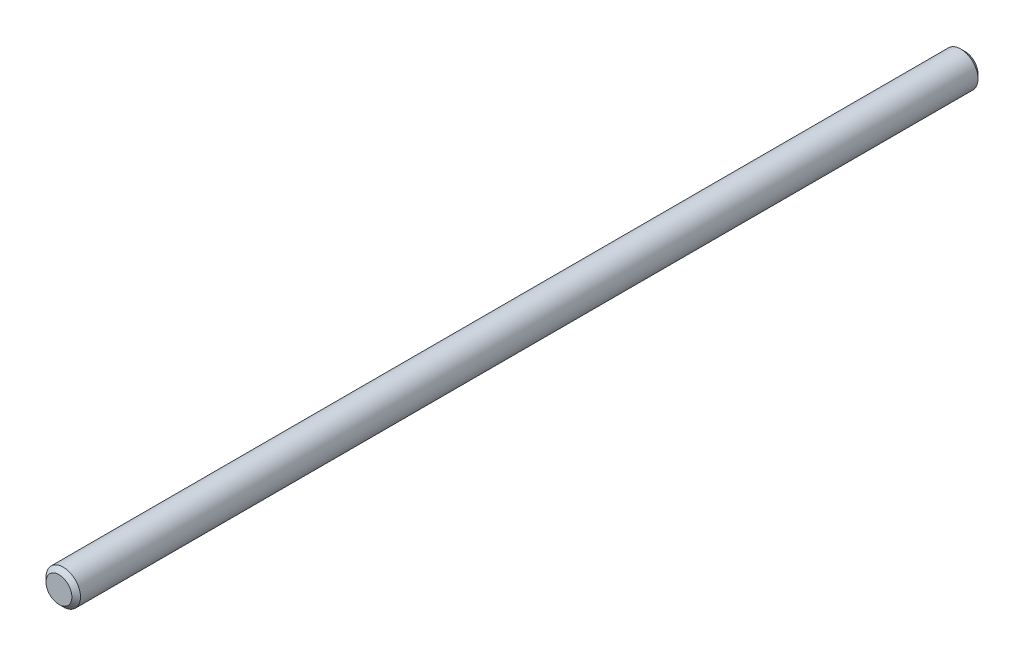
ISO-10303-21;
HEADER;
FILE_DESCRIPTION(('STEP AP214'),'2;1');
FILE_NAME('part.step','',(''),(''),'','','');
FILE_SCHEMA(('AUTOMOTIVE_DESIGN { 1 0 10303 214 1 1 1 1 }'));
ENDSEC;
DATA;
#1=APPLICATION_CONTEXT('core data for automotive mechanical design processes');
#2=APPLICATION_PROTOCOL_DEFINITION('international standard','automotive_design',2000,#1);
#3=PRODUCT_CONTEXT('',#1,'mechanical');
#4=PRODUCT('Part','Part','',(#3));
#5=PRODUCT_RELATED_PRODUCT_CATEGORY('part','',(#4));
#6=PRODUCT_DEFINITION_FORMATION('','',#4);
#7=PRODUCT_DEFINITION_CONTEXT('part definition',#1,'design');
#8=PRODUCT_DEFINITION('design','',#6,#7);
#9=PRODUCT_DEFINITION_SHAPE('','',#8);
#10=(LENGTH_UNIT() NAMED_UNIT(*) SI_UNIT(.MILLI.,.METRE.));
#11=(NAMED_UNIT(*) PLANE_ANGLE_UNIT() SI_UNIT($,.RADIAN.));
#12=(NAMED_UNIT(*) SI_UNIT($,.STERADIAN.) SOLID_ANGLE_UNIT());
#13=UNCERTAINTY_MEASURE_WITH_UNIT(LENGTH_MEASURE(1.E-05),#10,'distance_accuracy_value','');
#14=(GEOMETRIC_REPRESENTATION_CONTEXT(3) GLOBAL_UNCERTAINTY_ASSIGNED_CONTEXT((#13)) GLOBAL_UNIT_ASSIGNED_CONTEXT((#10,
#11,#12)) REPRESENTATION_CONTEXT('',''));
#15=CARTESIAN_POINT('',(0.,0.,0.));
#16=DIRECTION('',(0.,0.,1.));
#17=DIRECTION('',(1.,0.,0.));
#18=AXIS2_PLACEMENT_3D('',#15,#16,#17);
#19=CARTESIAN_POINT('',(0.,0.,210.));
#20=DIRECTION('',(0.,0.,-1.));
#21=DIRECTION('',(-1.,0.,0.));
#22=AXIS2_PLACEMENT_3D('',#19,#20,#21);
#23=CYLINDRICAL_SURFACE('',#22,4.);
#24=CARTESIAN_POINT('',(0.,0.,209.));
#25=DIRECTION('',(0.,0.,1.));
#26=DIRECTION('',(1.,0.,0.));
#27=AXIS2_PLACEMENT_3D('',#24,#25,#26);
#28=CIRCLE('',#27,4.);
#29=CARTESIAN_POINT('',(4.,0.,209.));
#30=VERTEX_POINT('',#29);
#31=EDGE_CURVE('E46',#30,#30,#28,.F.);
#32=ORIENTED_EDGE('',*,*,#31,.T.);
#33=EDGE_LOOP('',(#32));
#34=FACE_BOUND('',#33,.T.);
#35=CARTESIAN_POINT('',(0.,0.,0.999999999999945));
#36=DIRECTION('',(0.,0.,1.));
#37=DIRECTION('',(1.,0.,0.));
#38=AXIS2_PLACEMENT_3D('',#35,#36,#37);
#39=CIRCLE('',#38,4.);
#40=CARTESIAN_POINT('',(4.,0.,0.999999999999945));
#41=VERTEX_POINT('',#40);
#42=EDGE_CURVE('E50',#41,#41,#39,.T.);
#43=ORIENTED_EDGE('',*,*,#42,.T.);
#44=EDGE_LOOP('',(#43));
#45=FACE_BOUND('',#44,.T.);
#46=ADVANCED_FACE('F38',(#34,#45),#23,.T.);
#47=CARTESIAN_POINT('',(0.,0.,210.));
#48=DIRECTION('',(0.,0.,1.));
#49=DIRECTION('',(1.,0.,0.));
#50=AXIS2_PLACEMENT_3D('',#47,#48,#49);
#51=PLANE('',#50);
#52=CARTESIAN_POINT('',(0.,0.,210.));
#53=DIRECTION('',(0.,0.,1.));
#54=DIRECTION('',(1.,0.,0.));
#55=AXIS2_PLACEMENT_3D('',#52,#53,#54);
#56=CIRCLE('',#55,3.);
#57=CARTESIAN_POINT('',(3.,0.,210.));
#58=VERTEX_POINT('',#57);
#59=EDGE_CURVE('E54',#58,#58,#56,.T.);
#60=ORIENTED_EDGE('',*,*,#59,.T.);
#61=EDGE_LOOP('',(#60));
#62=FACE_BOUND('',#61,.T.);
#63=ADVANCED_FACE('F60',(#62),#51,.T.);
#64=CARTESIAN_POINT('',(0.,0.,0.));
#65=DIRECTION('',(0.,0.,1.));
#66=DIRECTION('',(1.,0.,0.));
#67=AXIS2_PLACEMENT_3D('',#64,#65,#66);
#68=PLANE('',#67);
#69=CARTESIAN_POINT('',(0.,0.,0.));
#70=DIRECTION('',(0.,0.,1.));
#71=DIRECTION('',(1.,0.,0.));
#72=AXIS2_PLACEMENT_3D('',#69,#70,#71);
#73=CIRCLE('',#72,3.00000000000003);
#74=CARTESIAN_POINT('',(3.00000000000003,0.,0.));
#75=VERTEX_POINT('',#74);
#76=EDGE_CURVE('E10',#75,#75,#73,.F.);
#77=ORIENTED_EDGE('',*,*,#76,.T.);
#78=EDGE_LOOP('',(#77));
#79=FACE_BOUND('',#78,.T.);
#80=ADVANCED_FACE('F64',(#79),#68,.F.);
#81=CARTESIAN_POINT('',(0.,0.,210.));
#82=DIRECTION('',(0.,0.,-1.));
#83=DIRECTION('',(-1.,0.,0.));
#84=AXIS2_PLACEMENT_3D('',#81,#82,#83);
#85=CONICAL_SURFACE('',#84,3.,0.78539816339746);
#86=ORIENTED_EDGE('',*,*,#31,.F.);
#87=EDGE_LOOP('',(#86));
#88=FACE_BOUND('',#87,.T.);
#89=ORIENTED_EDGE('',*,*,#59,.F.);
#90=EDGE_LOOP('',(#89));
#91=FACE_BOUND('',#90,.T.);
#92=ADVANCED_FACE('F62',(#88,#91),#85,.T.);
#93=CARTESIAN_POINT('',(0.,0.,0.999999999999945));
#94=DIRECTION('',(0.,0.,1.));
#95=DIRECTION('',(1.,0.,0.));
#96=AXIS2_PLACEMENT_3D('',#93,#94,#95);
#97=CONICAL_SURFACE('',#96,4.,0.78539816339746);
#98=ORIENTED_EDGE('',*,*,#76,.F.);
#99=EDGE_LOOP('',(#98));
#100=FACE_BOUND('',#99,.T.);
#101=ORIENTED_EDGE('',*,*,#42,.F.);
#102=EDGE_LOOP('',(#101));
#103=FACE_BOUND('',#102,.T.);
#104=ADVANCED_FACE('F41',(#100,#103),#97,.T.);
#105=CLOSED_SHELL('',(#46,#63,#80,#92,#104));
#106=MANIFOLD_SOLID_BREP('B2',#105);
#107=ADVANCED_BREP_SHAPE_REPRESENTATION('',(#18,#106),#14);
#108=SHAPE_DEFINITION_REPRESENTATION(#9,#107);
ENDSEC;
END-ISO-10303-21;
